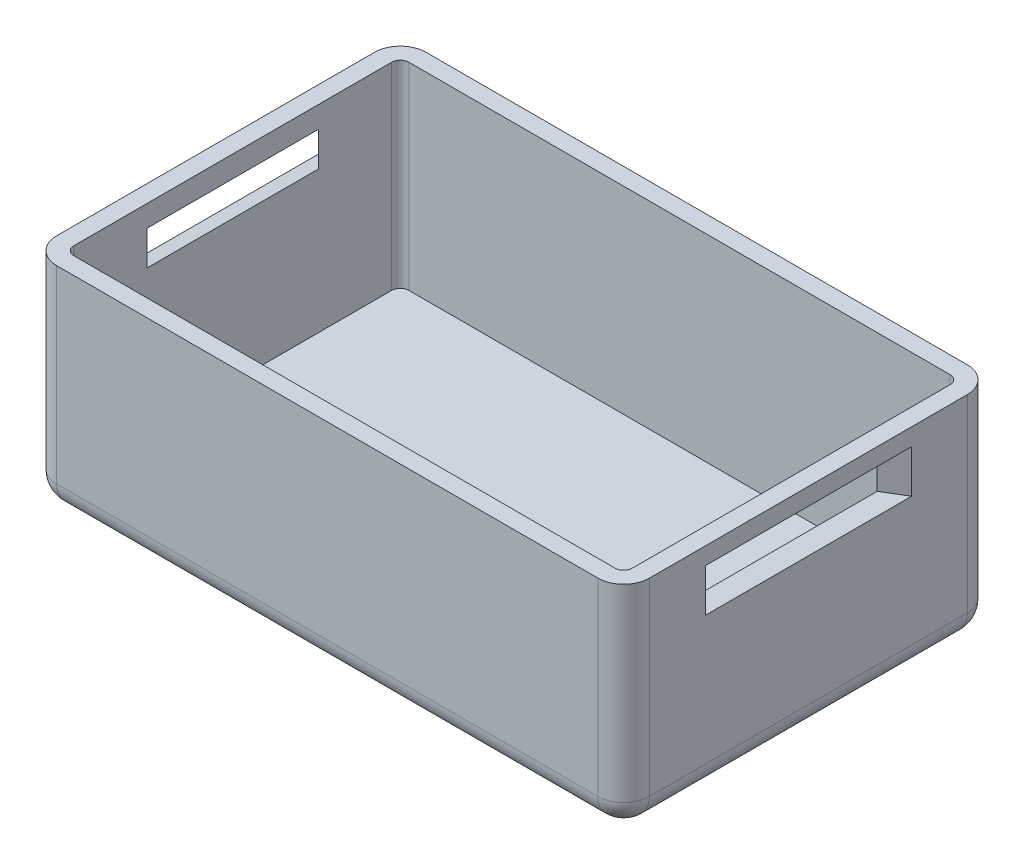
ISO-10303-21;
HEADER;
FILE_DESCRIPTION(('STEP AP214'),'2;1');
FILE_NAME('part.step','',(''),(''),'','','');
FILE_SCHEMA(('AUTOMOTIVE_DESIGN { 1 0 10303 214 1 1 1 1 }'));
ENDSEC;
DATA;
#1=APPLICATION_CONTEXT('core data for automotive mechanical design processes');
#2=APPLICATION_PROTOCOL_DEFINITION('international standard','automotive_design',2000,#1);
#3=PRODUCT_CONTEXT('',#1,'mechanical');
#4=PRODUCT('Part','Part','',(#3));
#5=PRODUCT_RELATED_PRODUCT_CATEGORY('part','',(#4));
#6=PRODUCT_DEFINITION_FORMATION('','',#4);
#7=PRODUCT_DEFINITION_CONTEXT('part definition',#1,'design');
#8=PRODUCT_DEFINITION('design','',#6,#7);
#9=PRODUCT_DEFINITION_SHAPE('','',#8);
#10=(LENGTH_UNIT() NAMED_UNIT(*) SI_UNIT(.MILLI.,.METRE.));
#11=(NAMED_UNIT(*) PLANE_ANGLE_UNIT() SI_UNIT($,.RADIAN.));
#12=(NAMED_UNIT(*) SI_UNIT($,.STERADIAN.) SOLID_ANGLE_UNIT());
#13=UNCERTAINTY_MEASURE_WITH_UNIT(LENGTH_MEASURE(1.E-05),#10,'distance_accuracy_value','');
#14=(GEOMETRIC_REPRESENTATION_CONTEXT(3) GLOBAL_UNCERTAINTY_ASSIGNED_CONTEXT((#13)) GLOBAL_UNIT_ASSIGNED_CONTEXT((#10,
#11,#12)) REPRESENTATION_CONTEXT('',''));
#15=CARTESIAN_POINT('',(0.,0.,0.));
#16=DIRECTION('',(0.,0.,1.));
#17=DIRECTION('',(1.,0.,0.));
#18=AXIS2_PLACEMENT_3D('',#15,#16,#17);
#19=CARTESIAN_POINT('',(34.0733017679364,43.3526697976125,39.89391233329));
#20=DIRECTION('',(1.,0.,0.));
#21=DIRECTION('',(0.,0.,-1.));
#22=AXIS2_PLACEMENT_3D('',#19,#20,#21);
#23=PLANE('',#22);
#24=DIRECTION('',(0.,-1.,0.));
#25=VECTOR('',#24,1.);
#26=CARTESIAN_POINT('',(34.0733017679364,43.3526697976125,36.89391233329));
#27=LINE('',#26,#25);
#28=CARTESIAN_POINT('',(34.0733017679364,43.3526697976125,36.89391233329));
#29=VERTEX_POINT('',#28);
#30=CARTESIAN_POINT('',(34.0733017679364,21.3526697976125,36.89391233329));
#31=VERTEX_POINT('',#30);
#32=EDGE_CURVE('E341',#29,#31,#27,.T.);
#33=ORIENTED_EDGE('',*,*,#32,.T.);
#34=DIRECTION('',(0.,0.,1.));
#35=VECTOR('',#34,1.);
#36=CARTESIAN_POINT('',(34.0733017679364,21.3526697976125,39.89391233329));
#37=LINE('',#36,#35);
#38=CARTESIAN_POINT('',(34.0733017679364,21.3526697976125,-0.106087666710018));
#39=VERTEX_POINT('',#38);
#40=EDGE_CURVE('E380',#31,#39,#37,.F.);
#41=ORIENTED_EDGE('',*,*,#40,.T.);
#42=DIRECTION('',(0.,-1.,0.));
#43=VECTOR('',#42,1.);
#44=CARTESIAN_POINT('',(34.0733017679364,43.3526697976125,-0.106087666710018));
#45=LINE('',#44,#43);
#46=CARTESIAN_POINT('',(34.0733017679364,43.3526697976125,-0.106087666710018));
#47=VERTEX_POINT('',#46);
#48=EDGE_CURVE('E339',#39,#47,#45,.F.);
#49=ORIENTED_EDGE('',*,*,#48,.T.);
#50=DIRECTION('',(0.,0.,1.));
#51=VECTOR('',#50,1.);
#52=CARTESIAN_POINT('',(34.0733017679364,43.3526697976125,39.89391233329));
#53=LINE('',#52,#51);
#54=EDGE_CURVE('E279',#47,#29,#53,.T.);
#55=ORIENTED_EDGE('',*,*,#54,.T.);
#56=EDGE_LOOP('',(#33,#41,#49,#55));
#57=FACE_BOUND('',#56,.T.);
#58=DIRECTION('',(0.,0.,-1.));
#59=VECTOR('',#58,1.);
#60=CARTESIAN_POINT('',(34.0733017679363,41.3526697976125,30.39391233329));
#61=LINE('',#60,#59);
#62=CARTESIAN_POINT('',(34.0733017679364,41.3526697976125,30.39391233329));
#63=VERTEX_POINT('',#62);
#64=CARTESIAN_POINT('',(34.0733017679363,41.3526697976125,6.39391233329));
#65=VERTEX_POINT('',#64);
#66=EDGE_CURVE('E62',#63,#65,#61,.T.);
#67=ORIENTED_EDGE('',*,*,#66,.T.);
#68=DIRECTION('',(0.,-1.,0.));
#69=VECTOR('',#68,1.);
#70=CARTESIAN_POINT('',(34.0733017679363,46.5965728697814,6.39391233329));
#71=LINE('',#70,#69);
#72=CARTESIAN_POINT('',(34.0733017679364,36.3526697976125,6.39391233329));
#73=VERTEX_POINT('',#72);
#74=EDGE_CURVE('E225',#65,#73,#71,.T.);
#75=ORIENTED_EDGE('',*,*,#74,.T.);
#76=DIRECTION('',(0.,0.,-1.));
#77=VECTOR('',#76,1.);
#78=CARTESIAN_POINT('',(34.0733017679364,36.3526697976125,30.39391233329));
#79=LINE('',#78,#77);
#80=CARTESIAN_POINT('',(34.0733017679364,36.3526697976125,30.39391233329));
#81=VERTEX_POINT('',#80);
#82=EDGE_CURVE('E232',#81,#73,#79,.T.);
#83=ORIENTED_EDGE('',*,*,#82,.F.);
#84=DIRECTION('',(0.,-1.,0.));
#85=VECTOR('',#84,1.);
#86=CARTESIAN_POINT('',(34.0733017679363,46.5965728697814,30.39391233329));
#87=LINE('',#86,#85);
#88=EDGE_CURVE('E238',#63,#81,#87,.T.);
#89=ORIENTED_EDGE('',*,*,#88,.F.);
#90=EDGE_LOOP('',(#67,#75,#83,#89));
#91=FACE_BOUND('',#90,.T.);
#92=ADVANCED_FACE('F47',(#57,#91),#23,.T.);
#93=CARTESIAN_POINT('',(32.0733017679363,43.3526697976125,37.89391233329));
#94=DIRECTION('',(1.,0.,0.));
#95=DIRECTION('',(0.,0.,-1.));
#96=AXIS2_PLACEMENT_3D('',#93,#94,#95);
#97=PLANE('',#96);
#98=DIRECTION('',(0.,0.,1.));
#99=VECTOR('',#98,1.);
#100=CARTESIAN_POINT('',(32.0733017679363,20.3526697976125,37.89391233329));
#101=LINE('',#100,#99);
#102=CARTESIAN_POINT('',(32.0733017679363,20.3526697976125,-0.106087666710011));
#103=VERTEX_POINT('',#102);
#104=CARTESIAN_POINT('',(32.0733017679363,20.3526697976125,36.89391233329));
#105=VERTEX_POINT('',#104);
#106=EDGE_CURVE('E280',#103,#105,#101,.T.);
#107=ORIENTED_EDGE('',*,*,#106,.T.);
#108=DIRECTION('',(0.,-1.,0.));
#109=VECTOR('',#108,1.);
#110=CARTESIAN_POINT('',(32.0733017679363,43.3526697976125,36.89391233329));
#111=LINE('',#110,#109);
#112=CARTESIAN_POINT('',(32.0733017679363,43.3526697976125,36.89391233329));
#113=VERTEX_POINT('',#112);
#114=EDGE_CURVE('E335',#105,#113,#111,.F.);
#115=ORIENTED_EDGE('',*,*,#114,.T.);
#116=DIRECTION('',(0.,0.,1.));
#117=VECTOR('',#116,1.);
#118=CARTESIAN_POINT('',(32.0733017679363,43.3526697976125,37.89391233329));
#119=LINE('',#118,#117);
#120=CARTESIAN_POINT('',(32.0733017679363,43.3526697976125,-0.106087666710011));
#121=VERTEX_POINT('',#120);
#122=EDGE_CURVE('E267',#121,#113,#119,.T.);
#123=ORIENTED_EDGE('',*,*,#122,.F.);
#124=DIRECTION('',(0.,-1.,0.));
#125=VECTOR('',#124,1.);
#126=CARTESIAN_POINT('',(32.0733017679363,20.3526697976125,-0.106087666710011));
#127=LINE('',#126,#125);
#128=EDGE_CURVE('E321',#121,#103,#127,.T.);
#129=ORIENTED_EDGE('',*,*,#128,.T.);
#130=EDGE_LOOP('',(#107,#115,#123,#129));
#131=FACE_BOUND('',#130,.T.);
#132=DIRECTION('',(0.,-1.,0.));
#133=VECTOR('',#132,1.);
#134=CARTESIAN_POINT('',(32.0733017679363,43.3526697976123,8.39391233328996));
#135=LINE('',#134,#133);
#136=CARTESIAN_POINT('',(32.0733017679363,40.8526697976125,8.39391233328998));
#137=VERTEX_POINT('',#136);
#138=CARTESIAN_POINT('',(32.0733017679363,36.8526697976125,8.39391233329));
#139=VERTEX_POINT('',#138);
#140=EDGE_CURVE('E11',#137,#139,#135,.T.);
#141=ORIENTED_EDGE('',*,*,#140,.F.);
#142=DIRECTION('',(0.,0.,-1.));
#143=VECTOR('',#142,1.);
#144=CARTESIAN_POINT('',(32.0733017679363,40.8526697976125,37.89391233329));
#145=LINE('',#144,#143);
#146=CARTESIAN_POINT('',(32.0733017679363,40.8526697976125,28.39391233329));
#147=VERTEX_POINT('',#146);
#148=EDGE_CURVE('E425',#147,#137,#145,.T.);
#149=ORIENTED_EDGE('',*,*,#148,.F.);
#150=DIRECTION('',(0.,1.,0.));
#151=VECTOR('',#150,1.);
#152=CARTESIAN_POINT('',(32.0733017679363,43.3526697976126,28.39391233329));
#153=LINE('',#152,#151);
#154=CARTESIAN_POINT('',(32.0733017679363,36.8526697976125,28.39391233329));
#155=VERTEX_POINT('',#154);
#156=EDGE_CURVE('E423',#155,#147,#153,.T.);
#157=ORIENTED_EDGE('',*,*,#156,.F.);
#158=DIRECTION('',(0.,0.,1.));
#159=VECTOR('',#158,1.);
#160=CARTESIAN_POINT('',(32.0733017679363,36.8526697976125,37.89391233329));
#161=LINE('',#160,#159);
#162=EDGE_CURVE('E55',#139,#155,#161,.T.);
#163=ORIENTED_EDGE('',*,*,#162,.F.);
#164=EDGE_LOOP('',(#141,#149,#157,#163));
#165=FACE_BOUND('',#164,.T.);
#166=ADVANCED_FACE('F429',(#131,#165),#97,.F.);
#167=CARTESIAN_POINT('',(-34.9266982320637,43.3526697976125,39.89391233329));
#168=DIRECTION('',(-1.,0.,0.));
#169=DIRECTION('',(0.,0.,1.));
#170=AXIS2_PLACEMENT_3D('',#167,#168,#169);
#171=PLANE('',#170);
#172=DIRECTION('',(0.,-1.,0.));
#173=VECTOR('',#172,1.);
#174=CARTESIAN_POINT('',(-34.9266982320637,43.3526697976125,-0.106087666710025));
#175=LINE('',#174,#173);
#176=CARTESIAN_POINT('',(-34.9266982320637,43.3526697976125,-0.106087666710025));
#177=VERTEX_POINT('',#176);
#178=CARTESIAN_POINT('',(-34.9266982320637,21.3526697976125,-0.106087666710025));
#179=VERTEX_POINT('',#178);
#180=EDGE_CURVE('E353',#177,#179,#175,.T.);
#181=ORIENTED_EDGE('',*,*,#180,.T.);
#182=DIRECTION('',(0.,0.,-1.));
#183=VECTOR('',#182,1.);
#184=CARTESIAN_POINT('',(-34.9266982320637,21.3526697976125,39.89391233329));
#185=LINE('',#184,#183);
#186=CARTESIAN_POINT('',(-34.9266982320637,21.3526697976125,36.89391233329));
#187=VERTEX_POINT('',#186);
#188=EDGE_CURVE('E388',#179,#187,#185,.F.);
#189=ORIENTED_EDGE('',*,*,#188,.T.);
#190=DIRECTION('',(0.,-1.,0.));
#191=VECTOR('',#190,1.);
#192=CARTESIAN_POINT('',(-34.9266982320637,43.3526697976125,36.89391233329));
#193=LINE('',#192,#191);
#194=CARTESIAN_POINT('',(-34.9266982320637,43.3526697976125,36.89391233329));
#195=VERTEX_POINT('',#194);
#196=EDGE_CURVE('E364',#187,#195,#193,.F.);
#197=ORIENTED_EDGE('',*,*,#196,.T.);
#198=DIRECTION('',(0.,0.,-1.));
#199=VECTOR('',#198,1.);
#200=CARTESIAN_POINT('',(-34.9266982320637,43.3526697976125,39.89391233329));
#201=LINE('',#200,#199);
#202=EDGE_CURVE('E296',#195,#177,#201,.T.);
#203=ORIENTED_EDGE('',*,*,#202,.T.);
#204=EDGE_LOOP('',(#181,#189,#197,#203));
#205=FACE_BOUND('',#204,.T.);
#206=DIRECTION('',(0.,0.,-1.));
#207=VECTOR('',#206,1.);
#208=CARTESIAN_POINT('',(-34.9266982320637,36.3526697976125,30.39391233329));
#209=LINE('',#208,#207);
#210=CARTESIAN_POINT('',(-34.9266982320637,36.3526697976125,30.39391233329));
#211=VERTEX_POINT('',#210);
#212=CARTESIAN_POINT('',(-34.9266982320637,36.3526697976125,6.39391233328997));
#213=VERTEX_POINT('',#212);
#214=EDGE_CURVE('E260',#211,#213,#209,.T.);
#215=ORIENTED_EDGE('',*,*,#214,.T.);
#216=DIRECTION('',(0.,1.,0.));
#217=VECTOR('',#216,1.);
#218=CARTESIAN_POINT('',(-34.9266982320637,31.1087667254437,6.39391233328997));
#219=LINE('',#218,#217);
#220=CARTESIAN_POINT('',(-34.9266982320637,41.3526697976125,6.39391233328997));
#221=VERTEX_POINT('',#220);
#222=EDGE_CURVE('E253',#213,#221,#219,.T.);
#223=ORIENTED_EDGE('',*,*,#222,.T.);
#224=DIRECTION('',(0.,0.,-1.));
#225=VECTOR('',#224,1.);
#226=CARTESIAN_POINT('',(-34.9266982320637,41.3526697976125,30.39391233329));
#227=LINE('',#226,#225);
#228=CARTESIAN_POINT('',(-34.9266982320637,41.3526697976125,30.39391233329));
#229=VERTEX_POINT('',#228);
#230=EDGE_CURVE('E263',#229,#221,#227,.T.);
#231=ORIENTED_EDGE('',*,*,#230,.F.);
#232=DIRECTION('',(0.,1.,0.));
#233=VECTOR('',#232,1.);
#234=CARTESIAN_POINT('',(-34.9266982320637,31.1087667254437,30.39391233329));
#235=LINE('',#234,#233);
#236=EDGE_CURVE('E250',#211,#229,#235,.T.);
#237=ORIENTED_EDGE('',*,*,#236,.F.);
#238=EDGE_LOOP('',(#215,#223,#231,#237));
#239=FACE_BOUND('',#238,.T.);
#240=ADVANCED_FACE('F450',(#205,#239),#171,.T.);
#241=CARTESIAN_POINT('',(-32.9266982320637,43.3526697976125,37.89391233329));
#242=DIRECTION('',(-1.,0.,0.));
#243=DIRECTION('',(0.,0.,1.));
#244=AXIS2_PLACEMENT_3D('',#241,#242,#243);
#245=PLANE('',#244);
#246=DIRECTION('',(0.,0.,-1.));
#247=VECTOR('',#246,1.);
#248=CARTESIAN_POINT('',(-32.9266982320637,20.3526697976125,37.89391233329));
#249=LINE('',#248,#247);
#250=CARTESIAN_POINT('',(-32.9266982320637,20.3526697976125,36.89391233329));
#251=VERTEX_POINT('',#250);
#252=CARTESIAN_POINT('',(-32.9266982320637,20.3526697976125,-0.106087666710018));
#253=VERTEX_POINT('',#252);
#254=EDGE_CURVE('E286',#251,#253,#249,.T.);
#255=ORIENTED_EDGE('',*,*,#254,.T.);
#256=DIRECTION('',(0.,-1.,0.));
#257=VECTOR('',#256,1.);
#258=CARTESIAN_POINT('',(-32.9266982320637,43.3526697976125,-0.106087666710018));
#259=LINE('',#258,#257);
#260=CARTESIAN_POINT('',(-32.9266982320637,43.3526697976125,-0.106087666710018));
#261=VERTEX_POINT('',#260);
#262=EDGE_CURVE('E317',#253,#261,#259,.F.);
#263=ORIENTED_EDGE('',*,*,#262,.T.);
#264=DIRECTION('',(0.,0.,-1.));
#265=VECTOR('',#264,1.);
#266=CARTESIAN_POINT('',(-32.9266982320637,43.3526697976125,37.89391233329));
#267=LINE('',#266,#265);
#268=CARTESIAN_POINT('',(-32.9266982320637,43.3526697976125,36.89391233329));
#269=VERTEX_POINT('',#268);
#270=EDGE_CURVE('E273',#269,#261,#267,.T.);
#271=ORIENTED_EDGE('',*,*,#270,.F.);
#272=DIRECTION('',(0.,-1.,0.));
#273=VECTOR('',#272,1.);
#274=CARTESIAN_POINT('',(-32.9266982320637,20.3526697976125,36.89391233329));
#275=LINE('',#274,#273);
#276=EDGE_CURVE('E301',#269,#251,#275,.T.);
#277=ORIENTED_EDGE('',*,*,#276,.T.);
#278=EDGE_LOOP('',(#255,#263,#271,#277));
#279=FACE_BOUND('',#278,.T.);
#280=DIRECTION('',(0.,1.,0.));
#281=VECTOR('',#280,1.);
#282=CARTESIAN_POINT('',(-32.9266982320637,43.3526697976125,8.39391233328997));
#283=LINE('',#282,#281);
#284=CARTESIAN_POINT('',(-32.9266982320637,36.8526697976125,8.39391233328997));
#285=VERTEX_POINT('',#284);
#286=CARTESIAN_POINT('',(-32.9266982320637,40.8526697976125,8.39391233328997));
#287=VERTEX_POINT('',#286);
#288=EDGE_CURVE('E421',#285,#287,#283,.T.);
#289=ORIENTED_EDGE('',*,*,#288,.F.);
#290=DIRECTION('',(0.,0.,-1.));
#291=VECTOR('',#290,1.);
#292=CARTESIAN_POINT('',(-32.9266982320637,36.8526697976125,37.89391233329));
#293=LINE('',#292,#291);
#294=CARTESIAN_POINT('',(-32.9266982320637,36.8526697976125,28.39391233329));
#295=VERTEX_POINT('',#294);
#296=EDGE_CURVE('E416',#295,#285,#293,.T.);
#297=ORIENTED_EDGE('',*,*,#296,.F.);
#298=DIRECTION('',(0.,-1.,0.));
#299=VECTOR('',#298,1.);
#300=CARTESIAN_POINT('',(-32.9266982320637,43.3526697976125,28.39391233329));
#301=LINE('',#300,#299);
#302=CARTESIAN_POINT('',(-32.9266982320637,40.8526697976125,28.39391233329));
#303=VERTEX_POINT('',#302);
#304=EDGE_CURVE('E394',#303,#295,#301,.T.);
#305=ORIENTED_EDGE('',*,*,#304,.F.);
#306=DIRECTION('',(0.,0.,1.));
#307=VECTOR('',#306,1.);
#308=CARTESIAN_POINT('',(-32.9266982320637,40.8526697976125,37.89391233329));
#309=LINE('',#308,#307);
#310=EDGE_CURVE('E418',#287,#303,#309,.T.);
#311=ORIENTED_EDGE('',*,*,#310,.F.);
#312=EDGE_LOOP('',(#289,#297,#305,#311));
#313=FACE_BOUND('',#312,.T.);
#314=ADVANCED_FACE('F575',(#279,#313),#245,.F.);
#315=CARTESIAN_POINT('',(34.0733017679364,43.3526697976125,-3.10608766671001));
#316=DIRECTION('',(0.,0.,-1.));
#317=DIRECTION('',(-1.,0.,0.));
#318=AXIS2_PLACEMENT_3D('',#315,#316,#317);
#319=PLANE('',#318);
#320=DIRECTION('',(0.,-1.,0.));
#321=VECTOR('',#320,1.);
#322=CARTESIAN_POINT('',(31.0733017679363,43.3526697976125,-3.10608766671001));
#323=LINE('',#322,#321);
#324=CARTESIAN_POINT('',(31.0733017679363,43.3526697976125,-3.10608766671001));
#325=VERTEX_POINT('',#324);
#326=CARTESIAN_POINT('',(31.0733017679363,21.3526697976125,-3.10608766671001));
#327=VERTEX_POINT('',#326);
#328=EDGE_CURVE('E356',#325,#327,#323,.T.);
#329=ORIENTED_EDGE('',*,*,#328,.T.);
#330=DIRECTION('',(1.,0.,0.));
#331=VECTOR('',#330,1.);
#332=CARTESIAN_POINT('',(34.0733017679364,21.3526697976125,-3.10608766671001));
#333=LINE('',#332,#331);
#334=CARTESIAN_POINT('',(-31.9266982320637,21.3526697976125,-3.10608766671002));
#335=VERTEX_POINT('',#334);
#336=EDGE_CURVE('E384',#327,#335,#333,.F.);
#337=ORIENTED_EDGE('',*,*,#336,.T.);
#338=DIRECTION('',(0.,-1.,0.));
#339=VECTOR('',#338,1.);
#340=CARTESIAN_POINT('',(-31.9266982320637,43.3526697976125,-3.10608766671002));
#341=LINE('',#340,#339);
#342=CARTESIAN_POINT('',(-31.9266982320637,43.3526697976125,-3.10608766671002));
#343=VERTEX_POINT('',#342);
#344=EDGE_CURVE('E359',#335,#343,#341,.F.);
#345=ORIENTED_EDGE('',*,*,#344,.T.);
#346=DIRECTION('',(1.,0.,0.));
#347=VECTOR('',#346,1.);
#348=CARTESIAN_POINT('',(34.0733017679364,43.3526697976125,-3.10608766671001));
#349=LINE('',#348,#347);
#350=EDGE_CURVE('E298',#343,#325,#349,.T.);
#351=ORIENTED_EDGE('',*,*,#350,.T.);
#352=EDGE_LOOP('',(#329,#337,#345,#351));
#353=FACE_BOUND('',#352,.T.);
#354=ADVANCED_FACE('F544',(#353),#319,.T.);
#355=CARTESIAN_POINT('',(34.0733017679364,43.3526697976125,39.89391233329));
#356=DIRECTION('',(0.,0.,1.));
#357=DIRECTION('',(1.,0.,0.));
#358=AXIS2_PLACEMENT_3D('',#355,#356,#357);
#359=PLANE('',#358);
#360=DIRECTION('',(0.,-1.,0.));
#361=VECTOR('',#360,1.);
#362=CARTESIAN_POINT('',(-31.9266982320637,43.3526697976125,39.89391233329));
#363=LINE('',#362,#361);
#364=CARTESIAN_POINT('',(-31.9266982320637,43.3526697976125,39.89391233329));
#365=VERTEX_POINT('',#364);
#366=CARTESIAN_POINT('',(-31.9266982320637,21.3526697976125,39.89391233329));
#367=VERTEX_POINT('',#366);
#368=EDGE_CURVE('E361',#365,#367,#363,.T.);
#369=ORIENTED_EDGE('',*,*,#368,.T.);
#370=DIRECTION('',(-1.,0.,0.));
#371=VECTOR('',#370,1.);
#372=CARTESIAN_POINT('',(34.0733017679364,21.3526697976125,39.89391233329));
#373=LINE('',#372,#371);
#374=CARTESIAN_POINT('',(31.0733017679363,21.3526697976125,39.89391233329));
#375=VERTEX_POINT('',#374);
#376=EDGE_CURVE('E392',#367,#375,#373,.F.);
#377=ORIENTED_EDGE('',*,*,#376,.T.);
#378=DIRECTION('',(0.,-1.,0.));
#379=VECTOR('',#378,1.);
#380=CARTESIAN_POINT('',(31.0733017679363,43.3526697976125,39.89391233329));
#381=LINE('',#380,#379);
#382=CARTESIAN_POINT('',(31.0733017679363,43.3526697976125,39.89391233329));
#383=VERTEX_POINT('',#382);
#384=EDGE_CURVE('E344',#375,#383,#381,.F.);
#385=ORIENTED_EDGE('',*,*,#384,.T.);
#386=DIRECTION('',(-1.,0.,0.));
#387=VECTOR('',#386,1.);
#388=CARTESIAN_POINT('',(34.0733017679364,43.3526697976125,39.89391233329));
#389=LINE('',#388,#387);
#390=EDGE_CURVE('E293',#383,#365,#389,.T.);
#391=ORIENTED_EDGE('',*,*,#390,.T.);
#392=EDGE_LOOP('',(#369,#377,#385,#391));
#393=FACE_BOUND('',#392,.T.);
#394=ADVANCED_FACE('F455',(#393),#359,.T.);
#395=CARTESIAN_POINT('',(-60.3437915710702,43.3526697976125,18.0152928946096));
#396=DIRECTION('',(0.,1.,0.));
#397=DIRECTION('',(0.,0.,1.));
#398=AXIS2_PLACEMENT_3D('',#395,#396,#397);
#399=PLANE('',#398);
#400=DIRECTION('',(1.,0.,0.));
#401=VECTOR('',#400,1.);
#402=CARTESIAN_POINT('',(32.0733017679363,43.3526697976125,-1.10608766671001));
#403=LINE('',#402,#401);
#404=CARTESIAN_POINT('',(-31.9266982320637,43.3526697976125,-1.10608766671002));
#405=VERTEX_POINT('',#404);
#406=CARTESIAN_POINT('',(31.0733017679363,43.3526697976125,-1.10608766671001));
#407=VERTEX_POINT('',#406);
#408=EDGE_CURVE('E276',#405,#407,#403,.T.);
#409=ORIENTED_EDGE('',*,*,#408,.T.);
#410=CARTESIAN_POINT('',(31.0733017679363,43.3526697976125,-0.106087666710011));
#411=DIRECTION('',(0.,1.,0.));
#412=DIRECTION('',(0.,0.,1.));
#413=AXIS2_PLACEMENT_3D('',#410,#411,#412);
#414=CIRCLE('',#413,1.);
#415=EDGE_CURVE('E328',#407,#121,#414,.F.);
#416=ORIENTED_EDGE('',*,*,#415,.T.);
#417=ORIENTED_EDGE('',*,*,#122,.T.);
#418=CARTESIAN_POINT('',(31.0733017679363,43.3526697976125,36.89391233329));
#419=DIRECTION('',(0.,1.,0.));
#420=DIRECTION('',(0.,0.,1.));
#421=AXIS2_PLACEMENT_3D('',#418,#419,#420);
#422=CIRCLE('',#421,1.);
#423=CARTESIAN_POINT('',(31.0733017679363,43.3526697976125,37.89391233329));
#424=VERTEX_POINT('',#423);
#425=EDGE_CURVE('E337',#113,#424,#422,.F.);
#426=ORIENTED_EDGE('',*,*,#425,.T.);
#427=DIRECTION('',(-1.,0.,0.));
#428=VECTOR('',#427,1.);
#429=CARTESIAN_POINT('',(32.0733017679363,43.3526697976125,37.89391233329));
#430=LINE('',#429,#428);
#431=CARTESIAN_POINT('',(-31.9266982320637,43.3526697976125,37.89391233329));
#432=VERTEX_POINT('',#431);
#433=EDGE_CURVE('E270',#424,#432,#430,.T.);
#434=ORIENTED_EDGE('',*,*,#433,.T.);
#435=CARTESIAN_POINT('',(-31.9266982320637,43.3526697976125,36.89391233329));
#436=DIRECTION('',(0.,1.,0.));
#437=DIRECTION('',(0.,0.,1.));
#438=AXIS2_PLACEMENT_3D('',#435,#436,#437);
#439=CIRCLE('',#438,1.);
#440=EDGE_CURVE('E310',#432,#269,#439,.F.);
#441=ORIENTED_EDGE('',*,*,#440,.T.);
#442=ORIENTED_EDGE('',*,*,#270,.T.);
#443=CARTESIAN_POINT('',(-31.9266982320637,43.3526697976125,-0.106087666710018));
#444=DIRECTION('',(0.,1.,0.));
#445=DIRECTION('',(0.,0.,1.));
#446=AXIS2_PLACEMENT_3D('',#443,#444,#445);
#447=CIRCLE('',#446,1.);
#448=EDGE_CURVE('E319',#261,#405,#447,.F.);
#449=ORIENTED_EDGE('',*,*,#448,.T.);
#450=EDGE_LOOP('',(#409,#416,#417,#426,#434,#441,#442,#449));
#451=FACE_BOUND('',#450,.T.);
#452=ORIENTED_EDGE('',*,*,#202,.F.);
#453=CARTESIAN_POINT('',(-31.9266982320637,43.3526697976125,36.89391233329));
#454=DIRECTION('',(0.,1.,0.));
#455=DIRECTION('',(0.,0.,1.));
#456=AXIS2_PLACEMENT_3D('',#453,#454,#455);
#457=CIRCLE('',#456,3.);
#458=EDGE_CURVE('E366',#195,#365,#457,.T.);
#459=ORIENTED_EDGE('',*,*,#458,.T.);
#460=ORIENTED_EDGE('',*,*,#390,.F.);
#461=CARTESIAN_POINT('',(31.0733017679363,43.3526697976125,36.89391233329));
#462=DIRECTION('',(0.,1.,0.));
#463=DIRECTION('',(0.,0.,1.));
#464=AXIS2_PLACEMENT_3D('',#461,#462,#463);
#465=CIRCLE('',#464,3.);
#466=EDGE_CURVE('E351',#383,#29,#465,.T.);
#467=ORIENTED_EDGE('',*,*,#466,.T.);
#468=ORIENTED_EDGE('',*,*,#54,.F.);
#469=CARTESIAN_POINT('',(31.0733017679363,43.3526697976125,-0.106087666710015));
#470=DIRECTION('',(0.,1.,0.));
#471=DIRECTION('',(0.,0.,1.));
#472=AXIS2_PLACEMENT_3D('',#469,#470,#471);
#473=CIRCLE('',#472,3.);
#474=EDGE_CURVE('E346',#47,#325,#473,.T.);
#475=ORIENTED_EDGE('',*,*,#474,.T.);
#476=ORIENTED_EDGE('',*,*,#350,.F.);
#477=CARTESIAN_POINT('',(-31.9266982320637,43.3526697976125,-0.106087666710025));
#478=DIRECTION('',(0.,1.,0.));
#479=DIRECTION('',(0.,0.,1.));
#480=AXIS2_PLACEMENT_3D('',#477,#478,#479);
#481=CIRCLE('',#480,3.);
#482=EDGE_CURVE('E348',#343,#177,#481,.T.);
#483=ORIENTED_EDGE('',*,*,#482,.T.);
#484=EDGE_LOOP('',(#452,#459,#460,#467,#468,#475,#476,#483));
#485=FACE_BOUND('',#484,.T.);
#486=ADVANCED_FACE('F539',(#451,#485),#399,.T.);
#487=CARTESIAN_POINT('',(32.0733017679363,43.3526697976125,-1.10608766671001));
#488=DIRECTION('',(0.,0.,-1.));
#489=DIRECTION('',(-1.,0.,0.));
#490=AXIS2_PLACEMENT_3D('',#487,#488,#489);
#491=PLANE('',#490);
#492=DIRECTION('',(1.,0.,0.));
#493=VECTOR('',#492,1.);
#494=CARTESIAN_POINT('',(32.0733017679363,20.3526697976125,-1.10608766671001));
#495=LINE('',#494,#493);
#496=CARTESIAN_POINT('',(-31.9266982320637,20.3526697976125,-1.10608766671002));
#497=VERTEX_POINT('',#496);
#498=CARTESIAN_POINT('',(31.0733017679363,20.3526697976125,-1.10608766671001));
#499=VERTEX_POINT('',#498);
#500=EDGE_CURVE('E271',#497,#499,#495,.T.);
#501=ORIENTED_EDGE('',*,*,#500,.T.);
#502=DIRECTION('',(0.,-1.,0.));
#503=VECTOR('',#502,1.);
#504=CARTESIAN_POINT('',(31.0733017679363,43.3526697976125,-1.10608766671001));
#505=LINE('',#504,#503);
#506=EDGE_CURVE('E326',#499,#407,#505,.F.);
#507=ORIENTED_EDGE('',*,*,#506,.T.);
#508=ORIENTED_EDGE('',*,*,#408,.F.);
#509=DIRECTION('',(0.,-1.,0.));
#510=VECTOR('',#509,1.);
#511=CARTESIAN_POINT('',(-31.9266982320637,20.3526697976125,-1.10608766671002));
#512=LINE('',#511,#510);
#513=EDGE_CURVE('E312',#405,#497,#512,.T.);
#514=ORIENTED_EDGE('',*,*,#513,.T.);
#515=EDGE_LOOP('',(#501,#507,#508,#514));
#516=FACE_BOUND('',#515,.T.);
#517=ADVANCED_FACE('F571',(#516),#491,.F.);
#518=CARTESIAN_POINT('',(32.0733017679363,43.3526697976125,37.89391233329));
#519=DIRECTION('',(0.,0.,1.));
#520=DIRECTION('',(1.,0.,0.));
#521=AXIS2_PLACEMENT_3D('',#518,#519,#520);
#522=PLANE('',#521);
#523=ORIENTED_EDGE('',*,*,#433,.F.);
#524=DIRECTION('',(0.,-1.,0.));
#525=VECTOR('',#524,1.);
#526=CARTESIAN_POINT('',(31.0733017679363,20.3526697976125,37.89391233329));
#527=LINE('',#526,#525);
#528=CARTESIAN_POINT('',(31.0733017679363,20.3526697976125,37.89391233329));
#529=VERTEX_POINT('',#528);
#530=EDGE_CURVE('E330',#424,#529,#527,.T.);
#531=ORIENTED_EDGE('',*,*,#530,.T.);
#532=DIRECTION('',(-1.,0.,0.));
#533=VECTOR('',#532,1.);
#534=CARTESIAN_POINT('',(32.0733017679363,20.3526697976125,37.89391233329));
#535=LINE('',#534,#533);
#536=CARTESIAN_POINT('',(-31.9266982320637,20.3526697976125,37.89391233329));
#537=VERTEX_POINT('',#536);
#538=EDGE_CURVE('E283',#529,#537,#535,.T.);
#539=ORIENTED_EDGE('',*,*,#538,.T.);
#540=DIRECTION('',(0.,-1.,0.));
#541=VECTOR('',#540,1.);
#542=CARTESIAN_POINT('',(-31.9266982320637,43.3526697976125,37.89391233329));
#543=LINE('',#542,#541);
#544=EDGE_CURVE('E307',#537,#432,#543,.F.);
#545=ORIENTED_EDGE('',*,*,#544,.T.);
#546=EDGE_LOOP('',(#523,#531,#539,#545));
#547=FACE_BOUND('',#546,.T.);
#548=ADVANCED_FACE('F623',(#547),#522,.F.);
#549=CARTESIAN_POINT('',(-60.3437915710702,20.3526697976125,18.0152928946096));
#550=DIRECTION('',(0.,-1.,0.));
#551=DIRECTION('',(0.,0.,-1.));
#552=AXIS2_PLACEMENT_3D('',#549,#550,#551);
#553=PLANE('',#552);
#554=ORIENTED_EDGE('',*,*,#538,.F.);
#555=CARTESIAN_POINT('',(31.0733017679363,20.3526697976125,36.89391233329));
#556=DIRECTION('',(0.,-1.,0.));
#557=DIRECTION('',(0.,0.,-1.));
#558=AXIS2_PLACEMENT_3D('',#555,#556,#557);
#559=CIRCLE('',#558,1.);
#560=EDGE_CURVE('E333',#529,#105,#559,.F.);
#561=ORIENTED_EDGE('',*,*,#560,.T.);
#562=ORIENTED_EDGE('',*,*,#106,.F.);
#563=CARTESIAN_POINT('',(31.0733017679363,20.3526697976125,-0.106087666710011));
#564=DIRECTION('',(0.,-1.,0.));
#565=DIRECTION('',(0.,0.,-1.));
#566=AXIS2_PLACEMENT_3D('',#563,#564,#565);
#567=CIRCLE('',#566,1.);
#568=EDGE_CURVE('E324',#103,#499,#567,.F.);
#569=ORIENTED_EDGE('',*,*,#568,.T.);
#570=ORIENTED_EDGE('',*,*,#500,.F.);
#571=CARTESIAN_POINT('',(-31.9266982320637,20.3526697976125,-0.106087666710018));
#572=DIRECTION('',(0.,-1.,0.));
#573=DIRECTION('',(0.,0.,-1.));
#574=AXIS2_PLACEMENT_3D('',#571,#572,#573);
#575=CIRCLE('',#574,1.);
#576=EDGE_CURVE('E315',#497,#253,#575,.F.);
#577=ORIENTED_EDGE('',*,*,#576,.T.);
#578=ORIENTED_EDGE('',*,*,#254,.F.);
#579=CARTESIAN_POINT('',(-31.9266982320637,20.3526697976125,36.89391233329));
#580=DIRECTION('',(0.,-1.,0.));
#581=DIRECTION('',(0.,0.,-1.));
#582=AXIS2_PLACEMENT_3D('',#579,#580,#581);
#583=CIRCLE('',#582,1.);
#584=EDGE_CURVE('E304',#251,#537,#583,.F.);
#585=ORIENTED_EDGE('',*,*,#584,.T.);
#586=EDGE_LOOP('',(#554,#561,#562,#569,#570,#577,#578,#585));
#587=FACE_BOUND('',#586,.T.);
#588=ADVANCED_FACE('F614',(#587),#553,.F.);
#589=CARTESIAN_POINT('',(-60.3437915710702,18.3526697976125,18.0152928946096));
#590=DIRECTION('',(0.,-1.,0.));
#591=DIRECTION('',(0.,0.,-1.));
#592=AXIS2_PLACEMENT_3D('',#589,#590,#591);
#593=PLANE('',#592);
#594=DIRECTION('',(1.,0.,0.));
#595=VECTOR('',#594,1.);
#596=CARTESIAN_POINT('',(-60.3437915710702,18.3526697976125,-0.106087666710025));
#597=LINE('',#596,#595);
#598=CARTESIAN_POINT('',(-31.9266982320637,18.3526697976125,-0.106087666710025));
#599=VERTEX_POINT('',#598);
#600=CARTESIAN_POINT('',(31.0733017679363,18.3526697976125,-0.106087666710015));
#601=VERTEX_POINT('',#600);
#602=EDGE_CURVE('E375',#599,#601,#597,.T.);
#603=ORIENTED_EDGE('',*,*,#602,.T.);
#604=DIRECTION('',(0.,0.,1.));
#605=VECTOR('',#604,1.);
#606=CARTESIAN_POINT('',(31.0733017679363,18.3526697976125,18.0152928946096));
#607=LINE('',#606,#605);
#608=CARTESIAN_POINT('',(31.0733017679363,18.3526697976125,36.89391233329));
#609=VERTEX_POINT('',#608);
#610=EDGE_CURVE('E377',#601,#609,#607,.T.);
#611=ORIENTED_EDGE('',*,*,#610,.T.);
#612=DIRECTION('',(-1.,0.,0.));
#613=VECTOR('',#612,1.);
#614=CARTESIAN_POINT('',(-60.3437915710702,18.3526697976125,36.89391233329));
#615=LINE('',#614,#613);
#616=CARTESIAN_POINT('',(-31.9266982320637,18.3526697976125,36.89391233329));
#617=VERTEX_POINT('',#616);
#618=EDGE_CURVE('E371',#609,#617,#615,.T.);
#619=ORIENTED_EDGE('',*,*,#618,.T.);
#620=DIRECTION('',(0.,0.,-1.));
#621=VECTOR('',#620,1.);
#622=CARTESIAN_POINT('',(-31.9266982320637,18.3526697976125,18.0152928946096));
#623=LINE('',#622,#621);
#624=EDGE_CURVE('E373',#617,#599,#623,.T.);
#625=ORIENTED_EDGE('',*,*,#624,.T.);
#626=EDGE_LOOP('',(#603,#611,#619,#625));
#627=FACE_BOUND('',#626,.T.);
#628=ADVANCED_FACE('F461',(#627),#593,.T.);
#629=CARTESIAN_POINT('',(-31.9266982320637,43.3526697976125,36.89391233329));
#630=DIRECTION('',(0.,1.,0.));
#631=DIRECTION('',(0.,0.,1.));
#632=AXIS2_PLACEMENT_3D('',#629,#630,#631);
#633=CYLINDRICAL_SURFACE('',#632,1.);
#634=ORIENTED_EDGE('',*,*,#440,.F.);
#635=ORIENTED_EDGE('',*,*,#544,.F.);
#636=ORIENTED_EDGE('',*,*,#584,.F.);
#637=ORIENTED_EDGE('',*,*,#276,.F.);
#638=EDGE_LOOP('',(#634,#635,#636,#637));
#639=FACE_BOUND('',#638,.T.);
#640=ADVANCED_FACE('F457',(#639),#633,.F.);
#641=CARTESIAN_POINT('',(-31.9266982320637,43.3526697976125,-0.106087666710018));
#642=DIRECTION('',(0.,1.,0.));
#643=DIRECTION('',(0.,0.,1.));
#644=AXIS2_PLACEMENT_3D('',#641,#642,#643);
#645=CYLINDRICAL_SURFACE('',#644,1.);
#646=ORIENTED_EDGE('',*,*,#448,.F.);
#647=ORIENTED_EDGE('',*,*,#262,.F.);
#648=ORIENTED_EDGE('',*,*,#576,.F.);
#649=ORIENTED_EDGE('',*,*,#513,.F.);
#650=EDGE_LOOP('',(#646,#647,#648,#649));
#651=FACE_BOUND('',#650,.T.);
#652=ADVANCED_FACE('F460',(#651),#645,.F.);
#653=CARTESIAN_POINT('',(31.0733017679363,43.3526697976125,-0.106087666710011));
#654=DIRECTION('',(0.,1.,0.));
#655=DIRECTION('',(0.,0.,1.));
#656=AXIS2_PLACEMENT_3D('',#653,#654,#655);
#657=CYLINDRICAL_SURFACE('',#656,1.);
#658=ORIENTED_EDGE('',*,*,#415,.F.);
#659=ORIENTED_EDGE('',*,*,#506,.F.);
#660=ORIENTED_EDGE('',*,*,#568,.F.);
#661=ORIENTED_EDGE('',*,*,#128,.F.);
#662=EDGE_LOOP('',(#658,#659,#660,#661));
#663=FACE_BOUND('',#662,.T.);
#664=ADVANCED_FACE('F465',(#663),#657,.F.);
#665=CARTESIAN_POINT('',(31.0733017679363,43.3526697976125,36.89391233329));
#666=DIRECTION('',(0.,1.,0.));
#667=DIRECTION('',(0.,0.,1.));
#668=AXIS2_PLACEMENT_3D('',#665,#666,#667);
#669=CYLINDRICAL_SURFACE('',#668,1.);
#670=ORIENTED_EDGE('',*,*,#425,.F.);
#671=ORIENTED_EDGE('',*,*,#114,.F.);
#672=ORIENTED_EDGE('',*,*,#560,.F.);
#673=ORIENTED_EDGE('',*,*,#530,.F.);
#674=EDGE_LOOP('',(#670,#671,#672,#673));
#675=FACE_BOUND('',#674,.T.);
#676=ADVANCED_FACE('F469',(#675),#669,.F.);
#677=CARTESIAN_POINT('',(31.0733017679363,43.3526697976125,36.89391233329));
#678=DIRECTION('',(0.,-1.,0.));
#679=DIRECTION('',(0.,0.,-1.));
#680=AXIS2_PLACEMENT_3D('',#677,#678,#679);
#681=CYLINDRICAL_SURFACE('',#680,3.);
#682=ORIENTED_EDGE('',*,*,#384,.F.);
#683=CARTESIAN_POINT('',(31.0733017679363,21.3526697976125,36.89391233329));
#684=DIRECTION('',(0.,-1.,0.));
#685=DIRECTION('',(0.,0.,-1.));
#686=AXIS2_PLACEMENT_3D('',#683,#684,#685);
#687=CIRCLE('',#686,3.);
#688=EDGE_CURVE('E368',#375,#31,#687,.F.);
#689=ORIENTED_EDGE('',*,*,#688,.T.);
#690=ORIENTED_EDGE('',*,*,#32,.F.);
#691=ORIENTED_EDGE('',*,*,#466,.F.);
#692=EDGE_LOOP('',(#682,#689,#690,#691));
#693=FACE_BOUND('',#692,.T.);
#694=ADVANCED_FACE('F473',(#693),#681,.T.);
#695=CARTESIAN_POINT('',(-31.9266982320637,43.3526697976125,-0.106087666710025));
#696=DIRECTION('',(0.,-1.,0.));
#697=DIRECTION('',(0.,0.,-1.));
#698=AXIS2_PLACEMENT_3D('',#695,#696,#697);
#699=CYLINDRICAL_SURFACE('',#698,3.);
#700=ORIENTED_EDGE('',*,*,#344,.F.);
#701=CARTESIAN_POINT('',(-31.9266982320637,21.3526697976125,-0.106087666710025));
#702=DIRECTION('',(0.,-1.,0.));
#703=DIRECTION('',(0.,0.,-1.));
#704=AXIS2_PLACEMENT_3D('',#701,#702,#703);
#705=CIRCLE('',#704,3.);
#706=EDGE_CURVE('E386',#335,#179,#705,.F.);
#707=ORIENTED_EDGE('',*,*,#706,.T.);
#708=ORIENTED_EDGE('',*,*,#180,.F.);
#709=ORIENTED_EDGE('',*,*,#482,.F.);
#710=EDGE_LOOP('',(#700,#707,#708,#709));
#711=FACE_BOUND('',#710,.T.);
#712=ADVANCED_FACE('F477',(#711),#699,.T.);
#713=CARTESIAN_POINT('',(31.0733017679363,43.3526697976125,-0.106087666710015));
#714=DIRECTION('',(0.,-1.,0.));
#715=DIRECTION('',(0.,0.,-1.));
#716=AXIS2_PLACEMENT_3D('',#713,#714,#715);
#717=CYLINDRICAL_SURFACE('',#716,3.);
#718=ORIENTED_EDGE('',*,*,#48,.F.);
#719=CARTESIAN_POINT('',(31.0733017679363,21.3526697976125,-0.106087666710015));
#720=DIRECTION('',(0.,-1.,0.));
#721=DIRECTION('',(0.,0.,-1.));
#722=AXIS2_PLACEMENT_3D('',#719,#720,#721);
#723=CIRCLE('',#722,3.);
#724=EDGE_CURVE('E382',#39,#327,#723,.F.);
#725=ORIENTED_EDGE('',*,*,#724,.T.);
#726=ORIENTED_EDGE('',*,*,#328,.F.);
#727=ORIENTED_EDGE('',*,*,#474,.F.);
#728=EDGE_LOOP('',(#718,#725,#726,#727));
#729=FACE_BOUND('',#728,.T.);
#730=ADVANCED_FACE('F481',(#729),#717,.T.);
#731=CARTESIAN_POINT('',(-31.9266982320637,43.3526697976125,36.89391233329));
#732=DIRECTION('',(0.,-1.,0.));
#733=DIRECTION('',(0.,0.,-1.));
#734=AXIS2_PLACEMENT_3D('',#731,#732,#733);
#735=CYLINDRICAL_SURFACE('',#734,3.);
#736=ORIENTED_EDGE('',*,*,#196,.F.);
#737=CARTESIAN_POINT('',(-31.9266982320637,21.3526697976125,36.89391233329));
#738=DIRECTION('',(0.,-1.,0.));
#739=DIRECTION('',(0.,0.,-1.));
#740=AXIS2_PLACEMENT_3D('',#737,#738,#739);
#741=CIRCLE('',#740,3.);
#742=EDGE_CURVE('E390',#187,#367,#741,.F.);
#743=ORIENTED_EDGE('',*,*,#742,.T.);
#744=ORIENTED_EDGE('',*,*,#368,.F.);
#745=ORIENTED_EDGE('',*,*,#458,.F.);
#746=EDGE_LOOP('',(#736,#743,#744,#745));
#747=FACE_BOUND('',#746,.T.);
#748=ADVANCED_FACE('F485',(#747),#735,.T.);
#749=CARTESIAN_POINT('',(-31.9266982320637,21.3526697976125,-0.106087666710025));
#750=DIRECTION('',(0.,-1.,0.));
#751=DIRECTION('',(0.,0.,-1.));
#752=AXIS2_PLACEMENT_3D('',#749,#750,#751);
#753=SPHERICAL_SURFACE('',#752,3.);
#754=CARTESIAN_POINT('',(-31.9266982320637,21.3526697976125,-0.106087666710025));
#755=DIRECTION('',(0.,0.,1.));
#756=DIRECTION('',(1.,0.,0.));
#757=AXIS2_PLACEMENT_3D('',#754,#755,#756);
#758=CIRCLE('',#757,3.);
#759=EDGE_CURVE('E410',#179,#599,#758,.T.);
#760=ORIENTED_EDGE('',*,*,#759,.F.);
#761=ORIENTED_EDGE('',*,*,#706,.F.);
#762=CARTESIAN_POINT('',(-31.9266982320637,21.3526697976125,-0.106087666710025));
#763=DIRECTION('',(1.,0.,0.));
#764=DIRECTION('',(0.,0.,-1.));
#765=AXIS2_PLACEMENT_3D('',#762,#763,#764);
#766=CIRCLE('',#765,3.);
#767=EDGE_CURVE('E284',#599,#335,#766,.T.);
#768=ORIENTED_EDGE('',*,*,#767,.F.);
#769=EDGE_LOOP('',(#760,#761,#768));
#770=FACE_BOUND('',#769,.T.);
#771=ADVANCED_FACE('F49',(#770),#753,.T.);
#772=CARTESIAN_POINT('',(-60.3437915710702,21.3526697976125,-0.106087666710025));
#773=DIRECTION('',(1.,0.,0.));
#774=DIRECTION('',(0.,0.,-1.));
#775=AXIS2_PLACEMENT_3D('',#772,#773,#774);
#776=CYLINDRICAL_SURFACE('',#775,3.);
#777=ORIENTED_EDGE('',*,*,#767,.T.);
#778=ORIENTED_EDGE('',*,*,#336,.F.);
#779=CARTESIAN_POINT('',(31.0733017679363,21.3526697976125,-0.106087666710015));
#780=DIRECTION('',(1.,0.,0.));
#781=DIRECTION('',(0.,0.,-1.));
#782=AXIS2_PLACEMENT_3D('',#779,#780,#781);
#783=CIRCLE('',#782,3.);
#784=EDGE_CURVE('E407',#601,#327,#783,.T.);
#785=ORIENTED_EDGE('',*,*,#784,.F.);
#786=ORIENTED_EDGE('',*,*,#602,.F.);
#787=EDGE_LOOP('',(#777,#778,#785,#786));
#788=FACE_BOUND('',#787,.T.);
#789=ADVANCED_FACE('F513',(#788),#776,.T.);
#790=CARTESIAN_POINT('',(-31.9266982320637,21.3526697976125,18.0152928946096));
#791=DIRECTION('',(0.,0.,-1.));
#792=DIRECTION('',(-1.,0.,0.));
#793=AXIS2_PLACEMENT_3D('',#790,#791,#792);
#794=CYLINDRICAL_SURFACE('',#793,3.);
#795=ORIENTED_EDGE('',*,*,#759,.T.);
#796=ORIENTED_EDGE('',*,*,#624,.F.);
#797=CARTESIAN_POINT('',(-31.9266982320637,21.3526697976125,36.89391233329));
#798=DIRECTION('',(0.,0.,1.));
#799=DIRECTION('',(1.,0.,0.));
#800=AXIS2_PLACEMENT_3D('',#797,#798,#799);
#801=CIRCLE('',#800,3.);
#802=EDGE_CURVE('E404',#187,#617,#801,.T.);
#803=ORIENTED_EDGE('',*,*,#802,.F.);
#804=ORIENTED_EDGE('',*,*,#188,.F.);
#805=EDGE_LOOP('',(#795,#796,#803,#804));
#806=FACE_BOUND('',#805,.T.);
#807=ADVANCED_FACE('F510',(#806),#794,.T.);
#808=CARTESIAN_POINT('',(31.0733017679363,21.3526697976125,-0.106087666710015));
#809=DIRECTION('',(0.,-1.,0.));
#810=DIRECTION('',(0.,0.,-1.));
#811=AXIS2_PLACEMENT_3D('',#808,#809,#810);
#812=SPHERICAL_SURFACE('',#811,3.);
#813=ORIENTED_EDGE('',*,*,#784,.T.);
#814=ORIENTED_EDGE('',*,*,#724,.F.);
#815=CARTESIAN_POINT('',(31.0733017679363,21.3526697976125,-0.106087666710015));
#816=DIRECTION('',(0.,0.,1.));
#817=DIRECTION('',(1.,0.,0.));
#818=AXIS2_PLACEMENT_3D('',#815,#816,#817);
#819=CIRCLE('',#818,3.);
#820=EDGE_CURVE('E401',#601,#39,#819,.T.);
#821=ORIENTED_EDGE('',*,*,#820,.F.);
#822=EDGE_LOOP('',(#813,#814,#821));
#823=FACE_BOUND('',#822,.T.);
#824=ADVANCED_FACE('F506',(#823),#812,.T.);
#825=CARTESIAN_POINT('',(-31.9266982320637,21.3526697976125,36.89391233329));
#826=DIRECTION('',(0.,-1.,0.));
#827=DIRECTION('',(0.,0.,-1.));
#828=AXIS2_PLACEMENT_3D('',#825,#826,#827);
#829=SPHERICAL_SURFACE('',#828,3.);
#830=ORIENTED_EDGE('',*,*,#742,.F.);
#831=ORIENTED_EDGE('',*,*,#802,.T.);
#832=CARTESIAN_POINT('',(-31.9266982320637,21.3526697976125,36.89391233329));
#833=DIRECTION('',(1.,0.,0.));
#834=DIRECTION('',(0.,0.,-1.));
#835=AXIS2_PLACEMENT_3D('',#832,#833,#834);
#836=CIRCLE('',#835,3.);
#837=EDGE_CURVE('E398',#367,#617,#836,.T.);
#838=ORIENTED_EDGE('',*,*,#837,.F.);
#839=EDGE_LOOP('',(#830,#831,#838));
#840=FACE_BOUND('',#839,.T.);
#841=ADVANCED_FACE('F502',(#840),#829,.T.);
#842=CARTESIAN_POINT('',(31.0733017679363,21.3526697976125,18.0152928946096));
#843=DIRECTION('',(0.,0.,1.));
#844=DIRECTION('',(1.,0.,0.));
#845=AXIS2_PLACEMENT_3D('',#842,#843,#844);
#846=CYLINDRICAL_SURFACE('',#845,3.);
#847=ORIENTED_EDGE('',*,*,#820,.T.);
#848=ORIENTED_EDGE('',*,*,#40,.F.);
#849=CARTESIAN_POINT('',(31.0733017679363,21.3526697976125,36.89391233329));
#850=DIRECTION('',(0.,0.,1.));
#851=DIRECTION('',(1.,0.,0.));
#852=AXIS2_PLACEMENT_3D('',#849,#850,#851);
#853=CIRCLE('',#852,3.);
#854=EDGE_CURVE('E396',#609,#31,#853,.T.);
#855=ORIENTED_EDGE('',*,*,#854,.F.);
#856=ORIENTED_EDGE('',*,*,#610,.F.);
#857=EDGE_LOOP('',(#847,#848,#855,#856));
#858=FACE_BOUND('',#857,.T.);
#859=ADVANCED_FACE('F498',(#858),#846,.T.);
#860=CARTESIAN_POINT('',(-60.3437915710702,21.3526697976125,36.89391233329));
#861=DIRECTION('',(-1.,0.,0.));
#862=DIRECTION('',(0.,0.,1.));
#863=AXIS2_PLACEMENT_3D('',#860,#861,#862);
#864=CYLINDRICAL_SURFACE('',#863,3.);
#865=ORIENTED_EDGE('',*,*,#837,.T.);
#866=ORIENTED_EDGE('',*,*,#618,.F.);
#867=CARTESIAN_POINT('',(31.0733017679363,21.3526697976125,36.89391233329));
#868=DIRECTION('',(1.,0.,0.));
#869=DIRECTION('',(0.,0.,-1.));
#870=AXIS2_PLACEMENT_3D('',#867,#868,#869);
#871=CIRCLE('',#870,3.);
#872=EDGE_CURVE('E266',#375,#609,#871,.T.);
#873=ORIENTED_EDGE('',*,*,#872,.F.);
#874=ORIENTED_EDGE('',*,*,#376,.F.);
#875=EDGE_LOOP('',(#865,#866,#873,#874));
#876=FACE_BOUND('',#875,.T.);
#877=ADVANCED_FACE('F494',(#876),#864,.T.);
#878=CARTESIAN_POINT('',(31.0733017679363,21.3526697976125,36.89391233329));
#879=DIRECTION('',(0.,-1.,0.));
#880=DIRECTION('',(0.,0.,-1.));
#881=AXIS2_PLACEMENT_3D('',#878,#879,#880);
#882=SPHERICAL_SURFACE('',#881,3.);
#883=ORIENTED_EDGE('',*,*,#854,.T.);
#884=ORIENTED_EDGE('',*,*,#688,.F.);
#885=ORIENTED_EDGE('',*,*,#872,.T.);
#886=EDGE_LOOP('',(#883,#884,#885));
#887=FACE_BOUND('',#886,.T.);
#888=ADVANCED_FACE('F490',(#887),#882,.T.);
#889=CARTESIAN_POINT('',(-34.9266982320637,41.3526697976125,30.39391233329));
#890=DIRECTION('',(-0.242535625036332,-0.970142500145332,0.));
#891=DIRECTION('',(0.970142500145332,-0.242535625036332,0.));
#892=AXIS2_PLACEMENT_3D('',#889,#890,#891);
#893=PLANE('',#892);
#894=ORIENTED_EDGE('',*,*,#310,.T.);
#895=DIRECTION('',(0.696310623822791,-0.174077655955697,-0.696310623822791));
#896=VECTOR('',#895,1.);
#897=CARTESIAN_POINT('',(-34.9266982320637,41.3526697976125,30.39391233329));
#898=LINE('',#897,#896);
#899=EDGE_CURVE('E258',#229,#303,#898,.T.);
#900=ORIENTED_EDGE('',*,*,#899,.F.);
#901=ORIENTED_EDGE('',*,*,#230,.T.);
#902=DIRECTION('',(-0.696310623822791,0.174077655955697,-0.696310623822791));
#903=VECTOR('',#902,1.);
#904=CARTESIAN_POINT('',(-23.2903345957,38.4435788885216,18.0302759696536));
#905=LINE('',#904,#903);
#906=EDGE_CURVE('E249',#287,#221,#905,.T.);
#907=ORIENTED_EDGE('',*,*,#906,.F.);
#908=EDGE_LOOP('',(#894,#900,#901,#907));
#909=FACE_BOUND('',#908,.T.);
#910=ADVANCED_FACE('F493',(#909),#893,.T.);
#911=CARTESIAN_POINT('',(-34.9266982320637,36.3526697976125,30.39391233329));
#912=DIRECTION('',(-0.242535625036332,0.970142500145332,0.));
#913=DIRECTION('',(-0.970142500145332,-0.242535625036332,0.));
#914=AXIS2_PLACEMENT_3D('',#911,#912,#913);
#915=PLANE('',#914);
#916=ORIENTED_EDGE('',*,*,#296,.T.);
#917=DIRECTION('',(-0.696310623822791,-0.174077655955697,-0.696310623822791));
#918=VECTOR('',#917,1.);
#919=CARTESIAN_POINT('',(-31.6835349680841,37.1634606136074,9.63707559726951));
#920=LINE('',#919,#918);
#921=EDGE_CURVE('E236',#285,#213,#920,.T.);
#922=ORIENTED_EDGE('',*,*,#921,.T.);
#923=ORIENTED_EDGE('',*,*,#214,.F.);
#924=DIRECTION('',(0.696310623822791,0.174077655955697,-0.696310623822791));
#925=VECTOR('',#924,1.);
#926=CARTESIAN_POINT('',(-31.6835349680841,37.1634606136074,27.1507490693104));
#927=LINE('',#926,#925);
#928=EDGE_CURVE('E246',#211,#295,#927,.T.);
#929=ORIENTED_EDGE('',*,*,#928,.T.);
#930=EDGE_LOOP('',(#916,#922,#923,#929));
#931=FACE_BOUND('',#930,.T.);
#932=ADVANCED_FACE('F667',(#931),#915,.T.);
#933=CARTESIAN_POINT('',(-30.9266982320637,31.1087667254437,10.39391233329));
#934=DIRECTION('',(-0.707106781186548,0.,0.707106781186548));
#935=DIRECTION('',(0.707106781186548,0.,0.707106781186548));
#936=AXIS2_PLACEMENT_3D('',#933,#934,#935);
#937=PLANE('',#936);
#938=ORIENTED_EDGE('',*,*,#288,.T.);
#939=ORIENTED_EDGE('',*,*,#906,.T.);
#940=ORIENTED_EDGE('',*,*,#222,.F.);
#941=ORIENTED_EDGE('',*,*,#921,.F.);
#942=EDGE_LOOP('',(#938,#939,#940,#941));
#943=FACE_BOUND('',#942,.T.);
#944=ADVANCED_FACE('F651',(#943),#937,.T.);
#945=CARTESIAN_POINT('',(-30.9266982320637,31.1087667254437,26.39391233329));
#946=DIRECTION('',(-0.707106781186548,0.,-0.707106781186548));
#947=DIRECTION('',(-0.707106781186548,0.,0.707106781186548));
#948=AXIS2_PLACEMENT_3D('',#945,#946,#947);
#949=PLANE('',#948);
#950=ORIENTED_EDGE('',*,*,#304,.T.);
#951=ORIENTED_EDGE('',*,*,#928,.F.);
#952=ORIENTED_EDGE('',*,*,#236,.T.);
#953=ORIENTED_EDGE('',*,*,#899,.T.);
#954=EDGE_LOOP('',(#950,#951,#952,#953));
#955=FACE_BOUND('',#954,.T.);
#956=ADVANCED_FACE('F441',(#955),#949,.T.);
#957=CARTESIAN_POINT('',(34.0733017679364,36.3526697976125,30.39391233329));
#958=DIRECTION('',(0.242535625036326,0.970142500145334,0.));
#959=DIRECTION('',(-0.970142500145334,0.242535625036326,0.));
#960=AXIS2_PLACEMENT_3D('',#957,#958,#959);
#961=PLANE('',#960);
#962=ORIENTED_EDGE('',*,*,#162,.T.);
#963=DIRECTION('',(-0.696310623822793,0.174077655955693,-0.696310623822791));
#964=VECTOR('',#963,1.);
#965=CARTESIAN_POINT('',(34.0733017679364,36.3526697976125,30.39391233329));
#966=LINE('',#965,#964);
#967=EDGE_CURVE('E70',#81,#155,#966,.T.);
#968=ORIENTED_EDGE('',*,*,#967,.F.);
#969=ORIENTED_EDGE('',*,*,#82,.T.);
#970=DIRECTION('',(0.696310623822793,-0.174077655955693,-0.696310623822791));
#971=VECTOR('',#970,1.);
#972=CARTESIAN_POINT('',(22.4369381315727,39.2617607067034,18.0302759696536));
#973=LINE('',#972,#971);
#974=EDGE_CURVE('E220',#139,#73,#973,.T.);
#975=ORIENTED_EDGE('',*,*,#974,.F.);
#976=EDGE_LOOP('',(#962,#968,#969,#975));
#977=FACE_BOUND('',#976,.T.);
#978=ADVANCED_FACE('F233',(#977),#961,.T.);
#979=CARTESIAN_POINT('',(34.0733017679363,41.3526697976125,30.39391233329));
#980=DIRECTION('',(0.242535625036339,-0.97014250014533,0.));
#981=DIRECTION('',(0.970142500145331,0.242535625036339,0.));
#982=AXIS2_PLACEMENT_3D('',#979,#980,#981);
#983=PLANE('',#982);
#984=ORIENTED_EDGE('',*,*,#148,.T.);
#985=DIRECTION('',(0.69631062382279,0.174077655955702,-0.696310623822791));
#986=VECTOR('',#985,1.);
#987=CARTESIAN_POINT('',(30.8301385039568,40.5418789816176,9.63707559726954));
#988=LINE('',#987,#986);
#989=EDGE_CURVE('E239',#137,#65,#988,.T.);
#990=ORIENTED_EDGE('',*,*,#989,.T.);
#991=ORIENTED_EDGE('',*,*,#66,.F.);
#992=DIRECTION('',(-0.69631062382279,-0.174077655955702,-0.696310623822791));
#993=VECTOR('',#992,1.);
#994=CARTESIAN_POINT('',(30.8301385039568,40.5418789816176,27.1507490693105));
#995=LINE('',#994,#993);
#996=EDGE_CURVE('E229',#63,#147,#995,.T.);
#997=ORIENTED_EDGE('',*,*,#996,.T.);
#998=EDGE_LOOP('',(#984,#990,#991,#997));
#999=FACE_BOUND('',#998,.T.);
#1000=ADVANCED_FACE('F431',(#999),#983,.T.);
#1001=CARTESIAN_POINT('',(30.0733017679363,46.5965728697813,10.39391233329));
#1002=DIRECTION('',(0.707106781186548,0.,0.707106781186548));
#1003=DIRECTION('',(-0.707106781186548,0.,0.707106781186548));
#1004=AXIS2_PLACEMENT_3D('',#1001,#1002,#1003);
#1005=PLANE('',#1004);
#1006=ORIENTED_EDGE('',*,*,#140,.T.);
#1007=ORIENTED_EDGE('',*,*,#974,.T.);
#1008=ORIENTED_EDGE('',*,*,#74,.F.);
#1009=ORIENTED_EDGE('',*,*,#989,.F.);
#1010=EDGE_LOOP('',(#1006,#1007,#1008,#1009));
#1011=FACE_BOUND('',#1010,.T.);
#1012=ADVANCED_FACE('F222',(#1011),#1005,.T.);
#1013=CARTESIAN_POINT('',(30.0733017679363,46.5965728697813,26.39391233329));
#1014=DIRECTION('',(0.707106781186548,0.,-0.707106781186548));
#1015=DIRECTION('',(0.707106781186548,0.,0.707106781186548));
#1016=AXIS2_PLACEMENT_3D('',#1013,#1014,#1015);
#1017=PLANE('',#1016);
#1018=ORIENTED_EDGE('',*,*,#156,.T.);
#1019=ORIENTED_EDGE('',*,*,#996,.F.);
#1020=ORIENTED_EDGE('',*,*,#88,.T.);
#1021=ORIENTED_EDGE('',*,*,#967,.T.);
#1022=EDGE_LOOP('',(#1018,#1019,#1020,#1021));
#1023=FACE_BOUND('',#1022,.T.);
#1024=ADVANCED_FACE('F430',(#1023),#1017,.T.);
#1025=CLOSED_SHELL('',(#92,#166,#240,#314,#354,#394,#486,#517,#548,#588,#628,#640,#652,#664,
#676,#694,#712,#730,#748,#771,#789,#807,#824,#841,#859,#877,#888,#910,#932,#944,#956,#978,#1000,
#1012,#1024));
#1026=MANIFOLD_SOLID_BREP('B2',#1025);
#1027=ADVANCED_BREP_SHAPE_REPRESENTATION('',(#18,#1026),#14);
#1028=SHAPE_DEFINITION_REPRESENTATION(#9,#1027);
ENDSEC;
END-ISO-10303-21;
